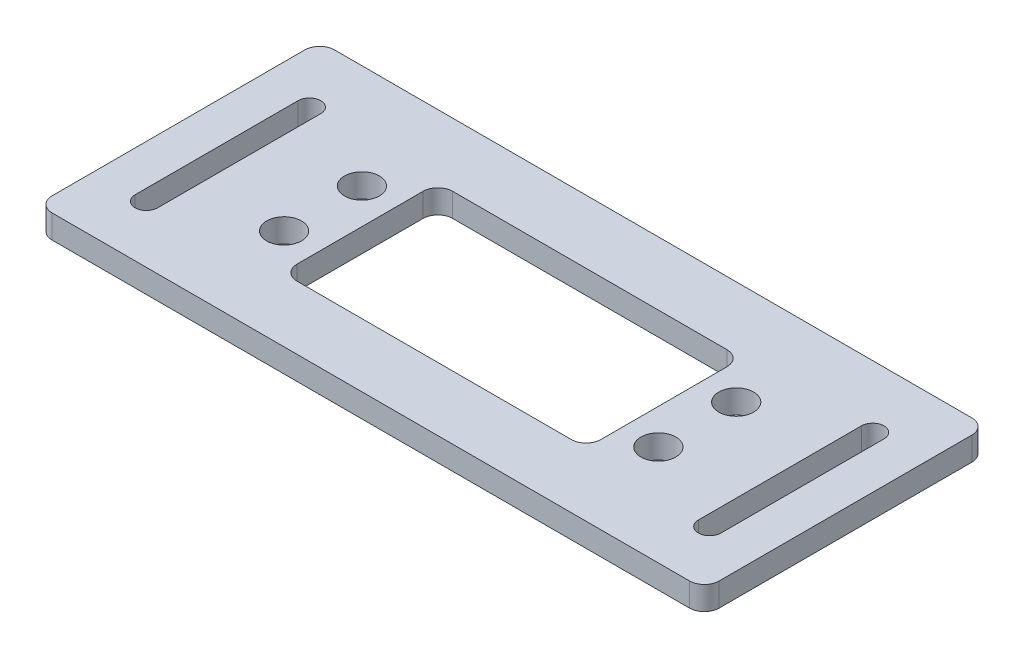
ISO-10303-21;
HEADER;
FILE_DESCRIPTION(('STEP AP214'),'2;1');
FILE_NAME('part.step','',(''),(''),'','','');
FILE_SCHEMA(('AUTOMOTIVE_DESIGN { 1 0 10303 214 1 1 1 1 }'));
ENDSEC;
DATA;
#1=APPLICATION_CONTEXT('core data for automotive mechanical design processes');
#2=APPLICATION_PROTOCOL_DEFINITION('international standard','automotive_design',2000,#1);
#3=PRODUCT_CONTEXT('',#1,'mechanical');
#4=PRODUCT('Part','Part','',(#3));
#5=PRODUCT_RELATED_PRODUCT_CATEGORY('part','',(#4));
#6=PRODUCT_DEFINITION_FORMATION('','',#4);
#7=PRODUCT_DEFINITION_CONTEXT('part definition',#1,'design');
#8=PRODUCT_DEFINITION('design','',#6,#7);
#9=PRODUCT_DEFINITION_SHAPE('','',#8);
#10=(LENGTH_UNIT() NAMED_UNIT(*) SI_UNIT(.MILLI.,.METRE.));
#11=(NAMED_UNIT(*) PLANE_ANGLE_UNIT() SI_UNIT($,.RADIAN.));
#12=(NAMED_UNIT(*) SI_UNIT($,.STERADIAN.) SOLID_ANGLE_UNIT());
#13=UNCERTAINTY_MEASURE_WITH_UNIT(LENGTH_MEASURE(1.E-05),#10,'distance_accuracy_value','');
#14=(GEOMETRIC_REPRESENTATION_CONTEXT(3) GLOBAL_UNCERTAINTY_ASSIGNED_CONTEXT((#13)) GLOBAL_UNIT_ASSIGNED_CONTEXT((#10,
#11,#12)) REPRESENTATION_CONTEXT('',''));
#15=CARTESIAN_POINT('',(0.,0.,0.));
#16=DIRECTION('',(0.,0.,1.));
#17=DIRECTION('',(1.,0.,0.));
#18=AXIS2_PLACEMENT_3D('',#15,#16,#17);
#19=CARTESIAN_POINT('',(-45.,3.175,19.05));
#20=DIRECTION('',(1.,0.,0.));
#21=DIRECTION('',(0.,0.,-1.));
#22=AXIS2_PLACEMENT_3D('',#19,#20,#21);
#23=PLANE('',#22);
#24=DIRECTION('',(0.,0.,1.));
#25=VECTOR('',#24,1.);
#26=CARTESIAN_POINT('',(-45.,3.175,19.05));
#27=LINE('',#26,#25);
#28=CARTESIAN_POINT('',(-45.,3.175,-17.05));
#29=VERTEX_POINT('',#28);
#30=CARTESIAN_POINT('',(-45.,3.175,17.05));
#31=VERTEX_POINT('',#30);
#32=EDGE_CURVE('E310',#29,#31,#27,.T.);
#33=ORIENTED_EDGE('',*,*,#32,.F.);
#34=DIRECTION('',(0.,-1.,0.));
#35=VECTOR('',#34,1.);
#36=CARTESIAN_POINT('',(-45.,3.175,-17.05));
#37=LINE('',#36,#35);
#38=CARTESIAN_POINT('',(-45.,0.,-17.05));
#39=VERTEX_POINT('',#38);
#40=EDGE_CURVE('E335',#29,#39,#37,.T.);
#41=ORIENTED_EDGE('',*,*,#40,.T.);
#42=DIRECTION('',(0.,0.,1.));
#43=VECTOR('',#42,1.);
#44=CARTESIAN_POINT('',(-45.,0.,19.05));
#45=LINE('',#44,#43);
#46=CARTESIAN_POINT('',(-45.,0.,17.05));
#47=VERTEX_POINT('',#46);
#48=EDGE_CURVE('E299',#39,#47,#45,.T.);
#49=ORIENTED_EDGE('',*,*,#48,.T.);
#50=DIRECTION('',(0.,-1.,0.));
#51=VECTOR('',#50,1.);
#52=CARTESIAN_POINT('',(-45.,3.175,17.05));
#53=LINE('',#52,#51);
#54=EDGE_CURVE('E323',#47,#31,#53,.F.);
#55=ORIENTED_EDGE('',*,*,#54,.T.);
#56=EDGE_LOOP('',(#33,#41,#49,#55));
#57=FACE_BOUND('',#56,.T.);
#58=ADVANCED_FACE('F32',(#57),#23,.F.);
#59=CARTESIAN_POINT('',(45.,3.175,19.05));
#60=DIRECTION('',(0.,0.,-1.));
#61=DIRECTION('',(-1.,0.,0.));
#62=AXIS2_PLACEMENT_3D('',#59,#60,#61);
#63=PLANE('',#62);
#64=DIRECTION('',(1.,0.,0.));
#65=VECTOR('',#64,1.);
#66=CARTESIAN_POINT('',(45.,0.,19.05));
#67=LINE('',#66,#65);
#68=CARTESIAN_POINT('',(-43.,0.,19.05));
#69=VERTEX_POINT('',#68);
#70=CARTESIAN_POINT('',(43.,0.,19.05));
#71=VERTEX_POINT('',#70);
#72=EDGE_CURVE('E326',#69,#71,#67,.T.);
#73=ORIENTED_EDGE('',*,*,#72,.T.);
#74=DIRECTION('',(0.,-1.,0.));
#75=VECTOR('',#74,1.);
#76=CARTESIAN_POINT('',(43.,3.175,19.05));
#77=LINE('',#76,#75);
#78=CARTESIAN_POINT('',(43.,3.175,19.05));
#79=VERTEX_POINT('',#78);
#80=EDGE_CURVE('E367',#71,#79,#77,.F.);
#81=ORIENTED_EDGE('',*,*,#80,.T.);
#82=DIRECTION('',(1.,0.,0.));
#83=VECTOR('',#82,1.);
#84=CARTESIAN_POINT('',(45.,3.175,19.05));
#85=LINE('',#84,#83);
#86=CARTESIAN_POINT('',(-43.,3.175,19.05));
#87=VERTEX_POINT('',#86);
#88=EDGE_CURVE('E313',#87,#79,#85,.T.);
#89=ORIENTED_EDGE('',*,*,#88,.F.);
#90=DIRECTION('',(0.,-1.,0.));
#91=VECTOR('',#90,1.);
#92=CARTESIAN_POINT('',(-43.,3.175,19.05));
#93=LINE('',#92,#91);
#94=EDGE_CURVE('E364',#87,#69,#93,.T.);
#95=ORIENTED_EDGE('',*,*,#94,.T.);
#96=EDGE_LOOP('',(#73,#81,#89,#95));
#97=FACE_BOUND('',#96,.T.);
#98=ADVANCED_FACE('F452',(#97),#63,.F.);
#99=CARTESIAN_POINT('',(45.,3.175,19.05));
#100=DIRECTION('',(-1.,0.,0.));
#101=DIRECTION('',(0.,0.,1.));
#102=AXIS2_PLACEMENT_3D('',#99,#100,#101);
#103=PLANE('',#102);
#104=DIRECTION('',(0.,0.,-1.));
#105=VECTOR('',#104,1.);
#106=CARTESIAN_POINT('',(45.,0.,19.05));
#107=LINE('',#106,#105);
#108=CARTESIAN_POINT('',(45.,0.,17.05));
#109=VERTEX_POINT('',#108);
#110=CARTESIAN_POINT('',(45.,0.,-17.05));
#111=VERTEX_POINT('',#110);
#112=EDGE_CURVE('E329',#109,#111,#107,.T.);
#113=ORIENTED_EDGE('',*,*,#112,.T.);
#114=DIRECTION('',(0.,-1.,0.));
#115=VECTOR('',#114,1.);
#116=CARTESIAN_POINT('',(45.,3.175,-17.05));
#117=LINE('',#116,#115);
#118=CARTESIAN_POINT('',(45.,3.175,-17.05));
#119=VERTEX_POINT('',#118);
#120=EDGE_CURVE('E362',#111,#119,#117,.F.);
#121=ORIENTED_EDGE('',*,*,#120,.T.);
#122=DIRECTION('',(0.,0.,-1.));
#123=VECTOR('',#122,1.);
#124=CARTESIAN_POINT('',(45.,3.175,19.05));
#125=LINE('',#124,#123);
#126=CARTESIAN_POINT('',(45.,3.175,17.05));
#127=VERTEX_POINT('',#126);
#128=EDGE_CURVE('E317',#127,#119,#125,.T.);
#129=ORIENTED_EDGE('',*,*,#128,.F.);
#130=DIRECTION('',(0.,-1.,0.));
#131=VECTOR('',#130,1.);
#132=CARTESIAN_POINT('',(45.,3.175,17.05));
#133=LINE('',#132,#131);
#134=EDGE_CURVE('E359',#127,#109,#133,.T.);
#135=ORIENTED_EDGE('',*,*,#134,.T.);
#136=EDGE_LOOP('',(#113,#121,#129,#135));
#137=FACE_BOUND('',#136,.T.);
#138=ADVANCED_FACE('F458',(#137),#103,.F.);
#139=CARTESIAN_POINT('',(45.,3.175,-19.05));
#140=DIRECTION('',(0.,0.,1.));
#141=DIRECTION('',(1.,0.,0.));
#142=AXIS2_PLACEMENT_3D('',#139,#140,#141);
#143=PLANE('',#142);
#144=DIRECTION('',(-1.,0.,0.));
#145=VECTOR('',#144,1.);
#146=CARTESIAN_POINT('',(45.,0.,-19.05));
#147=LINE('',#146,#145);
#148=CARTESIAN_POINT('',(43.,0.,-19.05));
#149=VERTEX_POINT('',#148);
#150=CARTESIAN_POINT('',(-43.,0.,-19.05));
#151=VERTEX_POINT('',#150);
#152=EDGE_CURVE('E314',#149,#151,#147,.T.);
#153=ORIENTED_EDGE('',*,*,#152,.T.);
#154=DIRECTION('',(0.,-1.,0.));
#155=VECTOR('',#154,1.);
#156=CARTESIAN_POINT('',(-43.,3.175,-19.05));
#157=LINE('',#156,#155);
#158=CARTESIAN_POINT('',(-43.,3.175,-19.05));
#159=VERTEX_POINT('',#158);
#160=EDGE_CURVE('E349',#151,#159,#157,.F.);
#161=ORIENTED_EDGE('',*,*,#160,.T.);
#162=DIRECTION('',(-1.,0.,0.));
#163=VECTOR('',#162,1.);
#164=CARTESIAN_POINT('',(45.,3.175,-19.05));
#165=LINE('',#164,#163);
#166=CARTESIAN_POINT('',(43.,3.175,-19.05));
#167=VERTEX_POINT('',#166);
#168=EDGE_CURVE('E320',#167,#159,#165,.T.);
#169=ORIENTED_EDGE('',*,*,#168,.F.);
#170=DIRECTION('',(0.,-1.,0.));
#171=VECTOR('',#170,1.);
#172=CARTESIAN_POINT('',(43.,3.175,-19.05));
#173=LINE('',#172,#171);
#174=EDGE_CURVE('E346',#167,#149,#173,.T.);
#175=ORIENTED_EDGE('',*,*,#174,.T.);
#176=EDGE_LOOP('',(#153,#161,#169,#175));
#177=FACE_BOUND('',#176,.T.);
#178=ADVANCED_FACE('F490',(#177),#143,.F.);
#179=CARTESIAN_POINT('',(0.,3.175,0.));
#180=DIRECTION('',(0.,1.,0.));
#181=DIRECTION('',(0.,0.,1.));
#182=AXIS2_PLACEMENT_3D('',#179,#180,#181);
#183=PLANE('',#182);
#184=CARTESIAN_POINT('',(-38.,3.175,-10.6700415525569));
#185=DIRECTION('',(0.,1.,0.));
#186=DIRECTION('',(0.,0.,1.));
#187=AXIS2_PLACEMENT_3D('',#184,#185,#186);
#188=CIRCLE('',#187,1.525);
#189=CARTESIAN_POINT('',(-36.475,3.175,-10.6700415525569));
#190=VERTEX_POINT('',#189);
#191=CARTESIAN_POINT('',(-39.525,3.175,-10.6700415525569));
#192=VERTEX_POINT('',#191);
#193=EDGE_CURVE('E47',#190,#192,#188,.T.);
#194=ORIENTED_EDGE('',*,*,#193,.F.);
#195=DIRECTION('',(0.,0.,-1.));
#196=VECTOR('',#195,1.);
#197=CARTESIAN_POINT('',(-36.475,3.175,-10.6700415525569));
#198=LINE('',#197,#196);
#199=CARTESIAN_POINT('',(-36.475,3.175,11.3299584474431));
#200=VERTEX_POINT('',#199);
#201=EDGE_CURVE('E213',#200,#190,#198,.T.);
#202=ORIENTED_EDGE('',*,*,#201,.F.);
#203=CARTESIAN_POINT('',(-38.,3.175,11.3299584474431));
#204=DIRECTION('',(0.,1.,0.));
#205=DIRECTION('',(0.,0.,1.));
#206=AXIS2_PLACEMENT_3D('',#203,#204,#205);
#207=CIRCLE('',#206,1.525);
#208=CARTESIAN_POINT('',(-39.525,3.175,11.3299584474431));
#209=VERTEX_POINT('',#208);
#210=EDGE_CURVE('E216',#209,#200,#207,.T.);
#211=ORIENTED_EDGE('',*,*,#210,.F.);
#212=DIRECTION('',(0.,0.,1.));
#213=VECTOR('',#212,1.);
#214=CARTESIAN_POINT('',(-39.525,3.175,-10.6700415525569));
#215=LINE('',#214,#213);
#216=EDGE_CURVE('E222',#192,#209,#215,.T.);
#217=ORIENTED_EDGE('',*,*,#216,.F.);
#218=EDGE_LOOP('',(#194,#202,#211,#217));
#219=FACE_BOUND('',#218,.T.);
#220=CARTESIAN_POINT('',(38.,3.175,-10.6700415525569));
#221=DIRECTION('',(0.,1.,0.));
#222=DIRECTION('',(0.,0.,-1.));
#223=AXIS2_PLACEMENT_3D('',#220,#221,#222);
#224=CIRCLE('',#223,1.525);
#225=CARTESIAN_POINT('',(39.525,3.175,-10.6700415525569));
#226=VERTEX_POINT('',#225);
#227=CARTESIAN_POINT('',(36.475,3.175,-10.6700415525569));
#228=VERTEX_POINT('',#227);
#229=EDGE_CURVE('E55',#226,#228,#224,.T.);
#230=ORIENTED_EDGE('',*,*,#229,.F.);
#231=DIRECTION('',(0.,0.,-1.));
#232=VECTOR('',#231,1.);
#233=CARTESIAN_POINT('',(39.525,3.175,-10.6700415525569));
#234=LINE('',#233,#232);
#235=CARTESIAN_POINT('',(39.525,3.175,11.3299584474431));
#236=VERTEX_POINT('',#235);
#237=EDGE_CURVE('E237',#236,#226,#234,.T.);
#238=ORIENTED_EDGE('',*,*,#237,.F.);
#239=CARTESIAN_POINT('',(38.,3.175,11.3299584474431));
#240=DIRECTION('',(0.,1.,0.));
#241=DIRECTION('',(0.,0.,-1.));
#242=AXIS2_PLACEMENT_3D('',#239,#240,#241);
#243=CIRCLE('',#242,1.525);
#244=CARTESIAN_POINT('',(36.475,3.175,11.3299584474431));
#245=VERTEX_POINT('',#244);
#246=EDGE_CURVE('E251',#245,#236,#243,.T.);
#247=ORIENTED_EDGE('',*,*,#246,.F.);
#248=DIRECTION('',(0.,0.,1.));
#249=VECTOR('',#248,1.);
#250=CARTESIAN_POINT('',(36.475,3.175,-10.6700415525569));
#251=LINE('',#250,#249);
#252=EDGE_CURVE('E248',#228,#245,#251,.T.);
#253=ORIENTED_EDGE('',*,*,#252,.F.);
#254=EDGE_LOOP('',(#230,#238,#247,#253));
#255=FACE_BOUND('',#254,.T.);
#256=CARTESIAN_POINT('',(25.25,3.175,5.50332943757828));
#257=DIRECTION('',(0.,1.,0.));
#258=DIRECTION('',(0.,0.,-1.));
#259=AXIS2_PLACEMENT_3D('',#256,#257,#258);
#260=CIRCLE('',#259,2.35);
#261=CARTESIAN_POINT('',(25.25,3.175,3.15332943757828));
#262=VERTEX_POINT('',#261);
#263=EDGE_CURVE('E229',#262,#262,#260,.T.);
#264=ORIENTED_EDGE('',*,*,#263,.F.);
#265=EDGE_LOOP('',(#264));
#266=FACE_BOUND('',#265,.T.);
#267=CARTESIAN_POINT('',(25.25,3.175,-4.99999999999997));
#268=DIRECTION('',(0.,1.,0.));
#269=DIRECTION('',(0.,0.,-1.));
#270=AXIS2_PLACEMENT_3D('',#267,#268,#269);
#271=CIRCLE('',#270,2.35);
#272=CARTESIAN_POINT('',(25.25,3.175,-7.34999999999997));
#273=VERTEX_POINT('',#272);
#274=EDGE_CURVE('E278',#273,#273,#271,.T.);
#275=ORIENTED_EDGE('',*,*,#274,.F.);
#276=EDGE_LOOP('',(#275));
#277=FACE_BOUND('',#276,.T.);
#278=CARTESIAN_POINT('',(-25.25,3.175,5.50332943757826));
#279=DIRECTION('',(0.,1.,0.));
#280=DIRECTION('',(0.,0.,1.));
#281=AXIS2_PLACEMENT_3D('',#278,#279,#280);
#282=CIRCLE('',#281,2.35);
#283=CARTESIAN_POINT('',(-25.25,3.175,7.85332943757826));
#284=VERTEX_POINT('',#283);
#285=EDGE_CURVE('E272',#284,#284,#282,.T.);
#286=ORIENTED_EDGE('',*,*,#285,.F.);
#287=EDGE_LOOP('',(#286));
#288=FACE_BOUND('',#287,.T.);
#289=CARTESIAN_POINT('',(-25.25,3.175,-5.));
#290=DIRECTION('',(0.,1.,0.));
#291=DIRECTION('',(0.,0.,1.));
#292=AXIS2_PLACEMENT_3D('',#289,#290,#291);
#293=CIRCLE('',#292,2.35);
#294=CARTESIAN_POINT('',(-25.25,3.175,-2.65));
#295=VERTEX_POINT('',#294);
#296=EDGE_CURVE('E266',#295,#295,#293,.T.);
#297=ORIENTED_EDGE('',*,*,#296,.F.);
#298=EDGE_LOOP('',(#297));
#299=FACE_BOUND('',#298,.T.);
#300=DIRECTION('',(0.,0.,1.));
#301=VECTOR('',#300,1.);
#302=CARTESIAN_POINT('',(-20.5,3.175,10.5));
#303=LINE('',#302,#301);
#304=CARTESIAN_POINT('',(-20.5,3.175,-8.49999999999999));
#305=VERTEX_POINT('',#304);
#306=CARTESIAN_POINT('',(-20.5,3.175,8.5));
#307=VERTEX_POINT('',#306);
#308=EDGE_CURVE('E265',#305,#307,#303,.T.);
#309=ORIENTED_EDGE('',*,*,#308,.F.);
#310=CARTESIAN_POINT('',(-18.5,3.175,-8.5));
#311=DIRECTION('',(0.,1.,0.));
#312=DIRECTION('',(0.,0.,1.));
#313=AXIS2_PLACEMENT_3D('',#310,#311,#312);
#314=CIRCLE('',#313,2.);
#315=CARTESIAN_POINT('',(-18.5,3.175,-10.5));
#316=VERTEX_POINT('',#315);
#317=EDGE_CURVE('E40',#305,#316,#314,.F.);
#318=ORIENTED_EDGE('',*,*,#317,.T.);
#319=DIRECTION('',(-1.,0.,0.));
#320=VECTOR('',#319,1.);
#321=CARTESIAN_POINT('',(20.5,3.175,-10.5));
#322=LINE('',#321,#320);
#323=CARTESIAN_POINT('',(18.5,3.175,-10.5));
#324=VERTEX_POINT('',#323);
#325=EDGE_CURVE('E290',#324,#316,#322,.T.);
#326=ORIENTED_EDGE('',*,*,#325,.F.);
#327=CARTESIAN_POINT('',(18.5,3.175,-8.50000000000001));
#328=DIRECTION('',(0.,1.,0.));
#329=DIRECTION('',(0.,0.,1.));
#330=AXIS2_PLACEMENT_3D('',#327,#328,#329);
#331=CIRCLE('',#330,2.);
#332=CARTESIAN_POINT('',(20.5,3.175,-8.5));
#333=VERTEX_POINT('',#332);
#334=EDGE_CURVE('E389',#324,#333,#331,.F.);
#335=ORIENTED_EDGE('',*,*,#334,.T.);
#336=DIRECTION('',(0.,0.,-1.));
#337=VECTOR('',#336,1.);
#338=CARTESIAN_POINT('',(20.5,3.175,10.5));
#339=LINE('',#338,#337);
#340=CARTESIAN_POINT('',(20.5,3.175,8.5));
#341=VERTEX_POINT('',#340);
#342=EDGE_CURVE('E305',#341,#333,#339,.T.);
#343=ORIENTED_EDGE('',*,*,#342,.F.);
#344=CARTESIAN_POINT('',(18.5,3.175,8.49999999999999));
#345=DIRECTION('',(0.,1.,0.));
#346=DIRECTION('',(0.,0.,1.));
#347=AXIS2_PLACEMENT_3D('',#344,#345,#346);
#348=CIRCLE('',#347,2.);
#349=CARTESIAN_POINT('',(18.5,3.175,10.5));
#350=VERTEX_POINT('',#349);
#351=EDGE_CURVE('E393',#341,#350,#348,.F.);
#352=ORIENTED_EDGE('',*,*,#351,.T.);
#353=DIRECTION('',(1.,0.,0.));
#354=VECTOR('',#353,1.);
#355=CARTESIAN_POINT('',(20.5,3.175,10.5));
#356=LINE('',#355,#354);
#357=CARTESIAN_POINT('',(-18.5,3.175,10.5));
#358=VERTEX_POINT('',#357);
#359=EDGE_CURVE('E302',#358,#350,#356,.T.);
#360=ORIENTED_EDGE('',*,*,#359,.F.);
#361=CARTESIAN_POINT('',(-18.5,3.175,8.5));
#362=DIRECTION('',(0.,1.,0.));
#363=DIRECTION('',(0.,0.,1.));
#364=AXIS2_PLACEMENT_3D('',#361,#362,#363);
#365=CIRCLE('',#364,2.);
#366=EDGE_CURVE('E397',#358,#307,#365,.F.);
#367=ORIENTED_EDGE('',*,*,#366,.T.);
#368=EDGE_LOOP('',(#309,#318,#326,#335,#343,#352,#360,#367));
#369=FACE_BOUND('',#368,.T.);
#370=ORIENTED_EDGE('',*,*,#168,.T.);
#371=CARTESIAN_POINT('',(-43.,3.175,-17.05));
#372=DIRECTION('',(0.,1.,0.));
#373=DIRECTION('',(0.,0.,1.));
#374=AXIS2_PLACEMENT_3D('',#371,#372,#373);
#375=CIRCLE('',#374,2.);
#376=EDGE_CURVE('E357',#159,#29,#375,.T.);
#377=ORIENTED_EDGE('',*,*,#376,.T.);
#378=ORIENTED_EDGE('',*,*,#32,.T.);
#379=CARTESIAN_POINT('',(-43.,3.175,17.05));
#380=DIRECTION('',(0.,1.,0.));
#381=DIRECTION('',(0.,0.,1.));
#382=AXIS2_PLACEMENT_3D('',#379,#380,#381);
#383=CIRCLE('',#382,2.);
#384=EDGE_CURVE('E351',#31,#87,#383,.T.);
#385=ORIENTED_EDGE('',*,*,#384,.T.);
#386=ORIENTED_EDGE('',*,*,#88,.T.);
#387=CARTESIAN_POINT('',(43.,3.175,17.05));
#388=DIRECTION('',(0.,1.,0.));
#389=DIRECTION('',(0.,0.,1.));
#390=AXIS2_PLACEMENT_3D('',#387,#388,#389);
#391=CIRCLE('',#390,2.);
#392=EDGE_CURVE('E353',#79,#127,#391,.T.);
#393=ORIENTED_EDGE('',*,*,#392,.T.);
#394=ORIENTED_EDGE('',*,*,#128,.T.);
#395=CARTESIAN_POINT('',(43.,3.175,-17.05));
#396=DIRECTION('',(0.,1.,0.));
#397=DIRECTION('',(0.,0.,1.));
#398=AXIS2_PLACEMENT_3D('',#395,#396,#397);
#399=CIRCLE('',#398,2.);
#400=EDGE_CURVE('E355',#119,#167,#399,.T.);
#401=ORIENTED_EDGE('',*,*,#400,.T.);
#402=EDGE_LOOP('',(#370,#377,#378,#385,#386,#393,#394,#401));
#403=FACE_BOUND('',#402,.T.);
#404=ADVANCED_FACE('F403',(#219,#255,#266,#277,#288,#299,#369,#403),#183,.T.);
#405=CARTESIAN_POINT('',(0.,0.,0.));
#406=DIRECTION('',(0.,1.,0.));
#407=DIRECTION('',(0.,0.,1.));
#408=AXIS2_PLACEMENT_3D('',#405,#406,#407);
#409=PLANE('',#408);
#410=DIRECTION('',(0.,0.,-1.));
#411=VECTOR('',#410,1.);
#412=CARTESIAN_POINT('',(-36.475,0.,-10.6700415525569));
#413=LINE('',#412,#411);
#414=CARTESIAN_POINT('',(-36.475,0.,11.3299584474431));
#415=VERTEX_POINT('',#414);
#416=CARTESIAN_POINT('',(-36.475,0.,-10.6700415525569));
#417=VERTEX_POINT('',#416);
#418=EDGE_CURVE('E200',#415,#417,#413,.T.);
#419=ORIENTED_EDGE('',*,*,#418,.T.);
#420=CARTESIAN_POINT('',(-38.,0.,-10.6700415525569));
#421=DIRECTION('',(0.,1.,0.));
#422=DIRECTION('',(0.,0.,1.));
#423=AXIS2_PLACEMENT_3D('',#420,#421,#422);
#424=CIRCLE('',#423,1.525);
#425=CARTESIAN_POINT('',(-39.525,0.,-10.6700415525569));
#426=VERTEX_POINT('',#425);
#427=EDGE_CURVE('E194',#417,#426,#424,.T.);
#428=ORIENTED_EDGE('',*,*,#427,.T.);
#429=DIRECTION('',(0.,0.,1.));
#430=VECTOR('',#429,1.);
#431=CARTESIAN_POINT('',(-39.525,0.,-10.6700415525569));
#432=LINE('',#431,#430);
#433=CARTESIAN_POINT('',(-39.525,0.,11.3299584474431));
#434=VERTEX_POINT('',#433);
#435=EDGE_CURVE('E204',#426,#434,#432,.T.);
#436=ORIENTED_EDGE('',*,*,#435,.T.);
#437=CARTESIAN_POINT('',(-38.,0.,11.3299584474431));
#438=DIRECTION('',(0.,1.,0.));
#439=DIRECTION('',(0.,0.,1.));
#440=AXIS2_PLACEMENT_3D('',#437,#438,#439);
#441=CIRCLE('',#440,1.525);
#442=EDGE_CURVE('E208',#434,#415,#441,.T.);
#443=ORIENTED_EDGE('',*,*,#442,.T.);
#444=EDGE_LOOP('',(#419,#428,#436,#443));
#445=FACE_BOUND('',#444,.T.);
#446=DIRECTION('',(0.,0.,-1.));
#447=VECTOR('',#446,1.);
#448=CARTESIAN_POINT('',(39.525,0.,-10.6700415525569));
#449=LINE('',#448,#447);
#450=CARTESIAN_POINT('',(39.525,0.,11.3299584474431));
#451=VERTEX_POINT('',#450);
#452=CARTESIAN_POINT('',(39.525,0.,-10.6700415525569));
#453=VERTEX_POINT('',#452);
#454=EDGE_CURVE('E243',#451,#453,#449,.T.);
#455=ORIENTED_EDGE('',*,*,#454,.T.);
#456=CARTESIAN_POINT('',(38.,0.,-10.6700415525569));
#457=DIRECTION('',(0.,1.,0.));
#458=DIRECTION('',(0.,0.,-1.));
#459=AXIS2_PLACEMENT_3D('',#456,#457,#458);
#460=CIRCLE('',#459,1.525);
#461=CARTESIAN_POINT('',(36.475,0.,-10.6700415525569));
#462=VERTEX_POINT('',#461);
#463=EDGE_CURVE('E233',#453,#462,#460,.T.);
#464=ORIENTED_EDGE('',*,*,#463,.T.);
#465=DIRECTION('',(0.,0.,1.));
#466=VECTOR('',#465,1.);
#467=CARTESIAN_POINT('',(36.475,0.,-10.6700415525569));
#468=LINE('',#467,#466);
#469=CARTESIAN_POINT('',(36.475,0.,11.3299584474431));
#470=VERTEX_POINT('',#469);
#471=EDGE_CURVE('E236',#462,#470,#468,.T.);
#472=ORIENTED_EDGE('',*,*,#471,.T.);
#473=CARTESIAN_POINT('',(38.,0.,11.3299584474431));
#474=DIRECTION('',(0.,1.,0.));
#475=DIRECTION('',(0.,0.,-1.));
#476=AXIS2_PLACEMENT_3D('',#473,#474,#475);
#477=CIRCLE('',#476,1.525);
#478=EDGE_CURVE('E240',#470,#451,#477,.T.);
#479=ORIENTED_EDGE('',*,*,#478,.T.);
#480=EDGE_LOOP('',(#455,#464,#472,#479));
#481=FACE_BOUND('',#480,.T.);
#482=CARTESIAN_POINT('',(25.25,0.,5.50332943757828));
#483=DIRECTION('',(0.,1.,0.));
#484=DIRECTION('',(0.,0.,-1.));
#485=AXIS2_PLACEMENT_3D('',#482,#483,#484);
#486=CIRCLE('',#485,2.35);
#487=CARTESIAN_POINT('',(25.25,0.,3.15332943757828));
#488=VERTEX_POINT('',#487);
#489=EDGE_CURVE('E281',#488,#488,#486,.T.);
#490=ORIENTED_EDGE('',*,*,#489,.T.);
#491=EDGE_LOOP('',(#490));
#492=FACE_BOUND('',#491,.T.);
#493=CARTESIAN_POINT('',(25.25,0.,-4.99999999999997));
#494=DIRECTION('',(0.,1.,0.));
#495=DIRECTION('',(0.,0.,-1.));
#496=AXIS2_PLACEMENT_3D('',#493,#494,#495);
#497=CIRCLE('',#496,2.35);
#498=CARTESIAN_POINT('',(25.25,0.,-7.34999999999997));
#499=VERTEX_POINT('',#498);
#500=EDGE_CURVE('E275',#499,#499,#497,.T.);
#501=ORIENTED_EDGE('',*,*,#500,.T.);
#502=EDGE_LOOP('',(#501));
#503=FACE_BOUND('',#502,.T.);
#504=CARTESIAN_POINT('',(-25.25,0.,5.50332943757826));
#505=DIRECTION('',(0.,1.,0.));
#506=DIRECTION('',(0.,0.,1.));
#507=AXIS2_PLACEMENT_3D('',#504,#505,#506);
#508=CIRCLE('',#507,2.35);
#509=CARTESIAN_POINT('',(-25.25,0.,7.85332943757826));
#510=VERTEX_POINT('',#509);
#511=EDGE_CURVE('E269',#510,#510,#508,.T.);
#512=ORIENTED_EDGE('',*,*,#511,.T.);
#513=EDGE_LOOP('',(#512));
#514=FACE_BOUND('',#513,.T.);
#515=CARTESIAN_POINT('',(-25.25,0.,-5.));
#516=DIRECTION('',(0.,1.,0.));
#517=DIRECTION('',(0.,0.,1.));
#518=AXIS2_PLACEMENT_3D('',#515,#516,#517);
#519=CIRCLE('',#518,2.35);
#520=CARTESIAN_POINT('',(-25.25,0.,-2.65));
#521=VERTEX_POINT('',#520);
#522=EDGE_CURVE('E262',#521,#521,#519,.T.);
#523=ORIENTED_EDGE('',*,*,#522,.T.);
#524=EDGE_LOOP('',(#523));
#525=FACE_BOUND('',#524,.T.);
#526=DIRECTION('',(0.,0.,-1.));
#527=VECTOR('',#526,1.);
#528=CARTESIAN_POINT('',(20.5,0.,10.5));
#529=LINE('',#528,#527);
#530=CARTESIAN_POINT('',(20.5,0.,8.5));
#531=VERTEX_POINT('',#530);
#532=CARTESIAN_POINT('',(20.5,0.,-8.5));
#533=VERTEX_POINT('',#532);
#534=EDGE_CURVE('E293',#531,#533,#529,.T.);
#535=ORIENTED_EDGE('',*,*,#534,.T.);
#536=CARTESIAN_POINT('',(18.5,0.,-8.50000000000001));
#537=DIRECTION('',(0.,1.,0.));
#538=DIRECTION('',(0.,0.,1.));
#539=AXIS2_PLACEMENT_3D('',#536,#537,#538);
#540=CIRCLE('',#539,2.);
#541=CARTESIAN_POINT('',(18.5,0.,-10.5));
#542=VERTEX_POINT('',#541);
#543=EDGE_CURVE('E391',#533,#542,#540,.T.);
#544=ORIENTED_EDGE('',*,*,#543,.T.);
#545=DIRECTION('',(-1.,0.,0.));
#546=VECTOR('',#545,1.);
#547=CARTESIAN_POINT('',(20.5,0.,-10.5));
#548=LINE('',#547,#546);
#549=CARTESIAN_POINT('',(-18.5,0.,-10.5));
#550=VERTEX_POINT('',#549);
#551=EDGE_CURVE('E296',#542,#550,#548,.T.);
#552=ORIENTED_EDGE('',*,*,#551,.T.);
#553=CARTESIAN_POINT('',(-18.5,0.,-8.5));
#554=DIRECTION('',(0.,1.,0.));
#555=DIRECTION('',(0.,0.,1.));
#556=AXIS2_PLACEMENT_3D('',#553,#554,#555);
#557=CIRCLE('',#556,2.);
#558=CARTESIAN_POINT('',(-20.5,0.,-8.49999999999999));
#559=VERTEX_POINT('',#558);
#560=EDGE_CURVE('E11',#550,#559,#557,.T.);
#561=ORIENTED_EDGE('',*,*,#560,.T.);
#562=DIRECTION('',(0.,0.,1.));
#563=VECTOR('',#562,1.);
#564=CARTESIAN_POINT('',(-20.5,0.,10.5));
#565=LINE('',#564,#563);
#566=CARTESIAN_POINT('',(-20.5,0.,8.5));
#567=VERTEX_POINT('',#566);
#568=EDGE_CURVE('E286',#559,#567,#565,.T.);
#569=ORIENTED_EDGE('',*,*,#568,.T.);
#570=CARTESIAN_POINT('',(-18.5,0.,8.5));
#571=DIRECTION('',(0.,1.,0.));
#572=DIRECTION('',(0.,0.,1.));
#573=AXIS2_PLACEMENT_3D('',#570,#571,#572);
#574=CIRCLE('',#573,2.);
#575=CARTESIAN_POINT('',(-18.5,0.,10.5));
#576=VERTEX_POINT('',#575);
#577=EDGE_CURVE('E399',#567,#576,#574,.T.);
#578=ORIENTED_EDGE('',*,*,#577,.T.);
#579=DIRECTION('',(1.,0.,0.));
#580=VECTOR('',#579,1.);
#581=CARTESIAN_POINT('',(20.5,0.,10.5));
#582=LINE('',#581,#580);
#583=CARTESIAN_POINT('',(18.5,0.,10.5));
#584=VERTEX_POINT('',#583);
#585=EDGE_CURVE('E289',#576,#584,#582,.T.);
#586=ORIENTED_EDGE('',*,*,#585,.T.);
#587=CARTESIAN_POINT('',(18.5,0.,8.49999999999999));
#588=DIRECTION('',(0.,1.,0.));
#589=DIRECTION('',(0.,0.,1.));
#590=AXIS2_PLACEMENT_3D('',#587,#588,#589);
#591=CIRCLE('',#590,2.);
#592=EDGE_CURVE('E395',#584,#531,#591,.T.);
#593=ORIENTED_EDGE('',*,*,#592,.T.);
#594=EDGE_LOOP('',(#535,#544,#552,#561,#569,#578,#586,#593));
#595=FACE_BOUND('',#594,.T.);
#596=ORIENTED_EDGE('',*,*,#48,.F.);
#597=CARTESIAN_POINT('',(-43.,0.,-17.05));
#598=DIRECTION('',(0.,1.,0.));
#599=DIRECTION('',(0.,0.,1.));
#600=AXIS2_PLACEMENT_3D('',#597,#598,#599);
#601=CIRCLE('',#600,2.);
#602=EDGE_CURVE('E344',#39,#151,#601,.F.);
#603=ORIENTED_EDGE('',*,*,#602,.T.);
#604=ORIENTED_EDGE('',*,*,#152,.F.);
#605=CARTESIAN_POINT('',(43.,0.,-17.05));
#606=DIRECTION('',(0.,1.,0.));
#607=DIRECTION('',(0.,0.,1.));
#608=AXIS2_PLACEMENT_3D('',#605,#606,#607);
#609=CIRCLE('',#608,2.);
#610=EDGE_CURVE('E342',#149,#111,#609,.F.);
#611=ORIENTED_EDGE('',*,*,#610,.T.);
#612=ORIENTED_EDGE('',*,*,#112,.F.);
#613=CARTESIAN_POINT('',(43.,0.,17.05));
#614=DIRECTION('',(0.,1.,0.));
#615=DIRECTION('',(0.,0.,1.));
#616=AXIS2_PLACEMENT_3D('',#613,#614,#615);
#617=CIRCLE('',#616,2.);
#618=EDGE_CURVE('E340',#109,#71,#617,.F.);
#619=ORIENTED_EDGE('',*,*,#618,.T.);
#620=ORIENTED_EDGE('',*,*,#72,.F.);
#621=CARTESIAN_POINT('',(-43.,0.,17.05));
#622=DIRECTION('',(0.,1.,0.));
#623=DIRECTION('',(0.,0.,1.));
#624=AXIS2_PLACEMENT_3D('',#621,#622,#623);
#625=CIRCLE('',#624,2.);
#626=EDGE_CURVE('E338',#69,#47,#625,.F.);
#627=ORIENTED_EDGE('',*,*,#626,.T.);
#628=EDGE_LOOP('',(#596,#603,#604,#611,#612,#619,#620,#627));
#629=FACE_BOUND('',#628,.T.);
#630=ADVANCED_FACE('F210',(#445,#481,#492,#503,#514,#525,#595,#629),#409,.F.);
#631=CARTESIAN_POINT('',(-20.5,0.,10.5));
#632=DIRECTION('',(-1.,0.,0.));
#633=DIRECTION('',(0.,0.,1.));
#634=AXIS2_PLACEMENT_3D('',#631,#632,#633);
#635=PLANE('',#634);
#636=ORIENTED_EDGE('',*,*,#308,.T.);
#637=DIRECTION('',(0.,1.,0.));
#638=VECTOR('',#637,1.);
#639=CARTESIAN_POINT('',(-20.5,0.,8.5));
#640=LINE('',#639,#638);
#641=EDGE_CURVE('E387',#307,#567,#640,.F.);
#642=ORIENTED_EDGE('',*,*,#641,.T.);
#643=ORIENTED_EDGE('',*,*,#568,.F.);
#644=DIRECTION('',(0.,1.,0.));
#645=VECTOR('',#644,1.);
#646=CARTESIAN_POINT('',(-20.5,3.175,-8.5));
#647=LINE('',#646,#645);
#648=EDGE_CURVE('E384',#559,#305,#647,.T.);
#649=ORIENTED_EDGE('',*,*,#648,.T.);
#650=EDGE_LOOP('',(#636,#642,#643,#649));
#651=FACE_BOUND('',#650,.T.);
#652=ADVANCED_FACE('F418',(#651),#635,.F.);
#653=CARTESIAN_POINT('',(20.5,0.,-10.5));
#654=DIRECTION('',(0.,0.,-1.));
#655=DIRECTION('',(-1.,0.,0.));
#656=AXIS2_PLACEMENT_3D('',#653,#654,#655);
#657=PLANE('',#656);
#658=ORIENTED_EDGE('',*,*,#551,.F.);
#659=DIRECTION('',(0.,1.,0.));
#660=VECTOR('',#659,1.);
#661=CARTESIAN_POINT('',(18.5,3.175,-10.5));
#662=LINE('',#661,#660);
#663=EDGE_CURVE('E371',#542,#324,#662,.T.);
#664=ORIENTED_EDGE('',*,*,#663,.T.);
#665=ORIENTED_EDGE('',*,*,#325,.T.);
#666=DIRECTION('',(0.,1.,0.));
#667=VECTOR('',#666,1.);
#668=CARTESIAN_POINT('',(-18.5,0.,-10.5));
#669=LINE('',#668,#667);
#670=EDGE_CURVE('E369',#316,#550,#669,.F.);
#671=ORIENTED_EDGE('',*,*,#670,.T.);
#672=EDGE_LOOP('',(#658,#664,#665,#671));
#673=FACE_BOUND('',#672,.T.);
#674=ADVANCED_FACE('F410',(#673),#657,.F.);
#675=CARTESIAN_POINT('',(20.5,0.,10.5));
#676=DIRECTION('',(1.,0.,0.));
#677=DIRECTION('',(0.,0.,-1.));
#678=AXIS2_PLACEMENT_3D('',#675,#676,#677);
#679=PLANE('',#678);
#680=ORIENTED_EDGE('',*,*,#342,.T.);
#681=DIRECTION('',(0.,1.,0.));
#682=VECTOR('',#681,1.);
#683=CARTESIAN_POINT('',(20.5,0.,-8.50000000000001));
#684=LINE('',#683,#682);
#685=EDGE_CURVE('E377',#333,#533,#684,.F.);
#686=ORIENTED_EDGE('',*,*,#685,.T.);
#687=ORIENTED_EDGE('',*,*,#534,.F.);
#688=DIRECTION('',(0.,1.,0.));
#689=VECTOR('',#688,1.);
#690=CARTESIAN_POINT('',(20.5,3.175,8.49999999999999));
#691=LINE('',#690,#689);
#692=EDGE_CURVE('E374',#531,#341,#691,.T.);
#693=ORIENTED_EDGE('',*,*,#692,.T.);
#694=EDGE_LOOP('',(#680,#686,#687,#693));
#695=FACE_BOUND('',#694,.T.);
#696=ADVANCED_FACE('F435',(#695),#679,.F.);
#697=CARTESIAN_POINT('',(20.5,0.,10.5));
#698=DIRECTION('',(0.,0.,1.));
#699=DIRECTION('',(1.,0.,0.));
#700=AXIS2_PLACEMENT_3D('',#697,#698,#699);
#701=PLANE('',#700);
#702=ORIENTED_EDGE('',*,*,#359,.T.);
#703=DIRECTION('',(0.,1.,0.));
#704=VECTOR('',#703,1.);
#705=CARTESIAN_POINT('',(18.5,0.,10.5));
#706=LINE('',#705,#704);
#707=EDGE_CURVE('E382',#350,#584,#706,.F.);
#708=ORIENTED_EDGE('',*,*,#707,.T.);
#709=ORIENTED_EDGE('',*,*,#585,.F.);
#710=DIRECTION('',(0.,1.,0.));
#711=VECTOR('',#710,1.);
#712=CARTESIAN_POINT('',(-18.5,3.175,10.5));
#713=LINE('',#712,#711);
#714=EDGE_CURVE('E379',#576,#358,#713,.T.);
#715=ORIENTED_EDGE('',*,*,#714,.T.);
#716=EDGE_LOOP('',(#702,#708,#709,#715));
#717=FACE_BOUND('',#716,.T.);
#718=ADVANCED_FACE('F426',(#717),#701,.F.);
#719=CARTESIAN_POINT('',(-25.25,0.,-5.));
#720=DIRECTION('',(0.,1.,0.));
#721=DIRECTION('',(0.,0.,1.));
#722=AXIS2_PLACEMENT_3D('',#719,#720,#721);
#723=CYLINDRICAL_SURFACE('',#722,2.35);
#724=ORIENTED_EDGE('',*,*,#522,.F.);
#725=EDGE_LOOP('',(#724));
#726=FACE_BOUND('',#725,.T.);
#727=ORIENTED_EDGE('',*,*,#296,.T.);
#728=EDGE_LOOP('',(#727));
#729=FACE_BOUND('',#728,.T.);
#730=ADVANCED_FACE('F614',(#726,#729),#723,.F.);
#731=CARTESIAN_POINT('',(-25.25,0.,5.50332943757826));
#732=DIRECTION('',(0.,1.,0.));
#733=DIRECTION('',(0.,0.,1.));
#734=AXIS2_PLACEMENT_3D('',#731,#732,#733);
#735=CYLINDRICAL_SURFACE('',#734,2.35);
#736=ORIENTED_EDGE('',*,*,#511,.F.);
#737=EDGE_LOOP('',(#736));
#738=FACE_BOUND('',#737,.T.);
#739=ORIENTED_EDGE('',*,*,#285,.T.);
#740=EDGE_LOOP('',(#739));
#741=FACE_BOUND('',#740,.T.);
#742=ADVANCED_FACE('F617',(#738,#741),#735,.F.);
#743=CARTESIAN_POINT('',(25.25,0.,-4.99999999999997));
#744=DIRECTION('',(0.,1.,0.));
#745=DIRECTION('',(0.,0.,1.));
#746=AXIS2_PLACEMENT_3D('',#743,#744,#745);
#747=CYLINDRICAL_SURFACE('',#746,2.35);
#748=ORIENTED_EDGE('',*,*,#500,.F.);
#749=EDGE_LOOP('',(#748));
#750=FACE_BOUND('',#749,.T.);
#751=ORIENTED_EDGE('',*,*,#274,.T.);
#752=EDGE_LOOP('',(#751));
#753=FACE_BOUND('',#752,.T.);
#754=ADVANCED_FACE('F621',(#750,#753),#747,.F.);
#755=CARTESIAN_POINT('',(25.25,0.,5.50332943757828));
#756=DIRECTION('',(0.,1.,0.));
#757=DIRECTION('',(0.,0.,1.));
#758=AXIS2_PLACEMENT_3D('',#755,#756,#757);
#759=CYLINDRICAL_SURFACE('',#758,2.35);
#760=ORIENTED_EDGE('',*,*,#489,.F.);
#761=EDGE_LOOP('',(#760));
#762=FACE_BOUND('',#761,.T.);
#763=ORIENTED_EDGE('',*,*,#263,.T.);
#764=EDGE_LOOP('',(#763));
#765=FACE_BOUND('',#764,.T.);
#766=ADVANCED_FACE('F468',(#762,#765),#759,.F.);
#767=CARTESIAN_POINT('',(-43.,3.175,-17.05));
#768=DIRECTION('',(0.,-1.,0.));
#769=DIRECTION('',(0.,0.,-1.));
#770=AXIS2_PLACEMENT_3D('',#767,#768,#769);
#771=CYLINDRICAL_SURFACE('',#770,2.);
#772=ORIENTED_EDGE('',*,*,#376,.F.);
#773=ORIENTED_EDGE('',*,*,#160,.F.);
#774=ORIENTED_EDGE('',*,*,#602,.F.);
#775=ORIENTED_EDGE('',*,*,#40,.F.);
#776=EDGE_LOOP('',(#772,#773,#774,#775));
#777=FACE_BOUND('',#776,.T.);
#778=ADVANCED_FACE('F464',(#777),#771,.T.);
#779=CARTESIAN_POINT('',(43.,3.175,-17.05));
#780=DIRECTION('',(0.,-1.,0.));
#781=DIRECTION('',(0.,0.,-1.));
#782=AXIS2_PLACEMENT_3D('',#779,#780,#781);
#783=CYLINDRICAL_SURFACE('',#782,2.);
#784=ORIENTED_EDGE('',*,*,#400,.F.);
#785=ORIENTED_EDGE('',*,*,#120,.F.);
#786=ORIENTED_EDGE('',*,*,#610,.F.);
#787=ORIENTED_EDGE('',*,*,#174,.F.);
#788=EDGE_LOOP('',(#784,#785,#786,#787));
#789=FACE_BOUND('',#788,.T.);
#790=ADVANCED_FACE('F467',(#789),#783,.T.);
#791=CARTESIAN_POINT('',(43.,3.175,17.05));
#792=DIRECTION('',(0.,-1.,0.));
#793=DIRECTION('',(0.,0.,-1.));
#794=AXIS2_PLACEMENT_3D('',#791,#792,#793);
#795=CYLINDRICAL_SURFACE('',#794,2.);
#796=ORIENTED_EDGE('',*,*,#392,.F.);
#797=ORIENTED_EDGE('',*,*,#80,.F.);
#798=ORIENTED_EDGE('',*,*,#618,.F.);
#799=ORIENTED_EDGE('',*,*,#134,.F.);
#800=EDGE_LOOP('',(#796,#797,#798,#799));
#801=FACE_BOUND('',#800,.T.);
#802=ADVANCED_FACE('F448',(#801),#795,.T.);
#803=CARTESIAN_POINT('',(-43.,3.175,17.05));
#804=DIRECTION('',(0.,-1.,0.));
#805=DIRECTION('',(0.,0.,-1.));
#806=AXIS2_PLACEMENT_3D('',#803,#804,#805);
#807=CYLINDRICAL_SURFACE('',#806,2.);
#808=ORIENTED_EDGE('',*,*,#384,.F.);
#809=ORIENTED_EDGE('',*,*,#54,.F.);
#810=ORIENTED_EDGE('',*,*,#626,.F.);
#811=ORIENTED_EDGE('',*,*,#94,.F.);
#812=EDGE_LOOP('',(#808,#809,#810,#811));
#813=FACE_BOUND('',#812,.T.);
#814=ADVANCED_FACE('F441',(#813),#807,.T.);
#815=CARTESIAN_POINT('',(18.5,0.,-8.50000000000001));
#816=DIRECTION('',(0.,-1.,0.));
#817=DIRECTION('',(0.,0.,-1.));
#818=AXIS2_PLACEMENT_3D('',#815,#816,#817);
#819=CYLINDRICAL_SURFACE('',#818,2.);
#820=ORIENTED_EDGE('',*,*,#543,.F.);
#821=ORIENTED_EDGE('',*,*,#685,.F.);
#822=ORIENTED_EDGE('',*,*,#334,.F.);
#823=ORIENTED_EDGE('',*,*,#663,.F.);
#824=EDGE_LOOP('',(#820,#821,#822,#823));
#825=FACE_BOUND('',#824,.T.);
#826=ADVANCED_FACE('F439',(#825),#819,.F.);
#827=CARTESIAN_POINT('',(18.5,0.,8.49999999999999));
#828=DIRECTION('',(0.,-1.,0.));
#829=DIRECTION('',(0.,0.,-1.));
#830=AXIS2_PLACEMENT_3D('',#827,#828,#829);
#831=CYLINDRICAL_SURFACE('',#830,2.);
#832=ORIENTED_EDGE('',*,*,#592,.F.);
#833=ORIENTED_EDGE('',*,*,#707,.F.);
#834=ORIENTED_EDGE('',*,*,#351,.F.);
#835=ORIENTED_EDGE('',*,*,#692,.F.);
#836=EDGE_LOOP('',(#832,#833,#834,#835));
#837=FACE_BOUND('',#836,.T.);
#838=ADVANCED_FACE('F430',(#837),#831,.F.);
#839=CARTESIAN_POINT('',(-18.5,0.,8.5));
#840=DIRECTION('',(0.,-1.,0.));
#841=DIRECTION('',(0.,0.,-1.));
#842=AXIS2_PLACEMENT_3D('',#839,#840,#841);
#843=CYLINDRICAL_SURFACE('',#842,2.);
#844=ORIENTED_EDGE('',*,*,#577,.F.);
#845=ORIENTED_EDGE('',*,*,#641,.F.);
#846=ORIENTED_EDGE('',*,*,#366,.F.);
#847=ORIENTED_EDGE('',*,*,#714,.F.);
#848=EDGE_LOOP('',(#844,#845,#846,#847));
#849=FACE_BOUND('',#848,.T.);
#850=ADVANCED_FACE('F421',(#849),#843,.F.);
#851=CARTESIAN_POINT('',(-18.5,0.,-8.5));
#852=DIRECTION('',(0.,-1.,0.));
#853=DIRECTION('',(0.,0.,-1.));
#854=AXIS2_PLACEMENT_3D('',#851,#852,#853);
#855=CYLINDRICAL_SURFACE('',#854,2.);
#856=ORIENTED_EDGE('',*,*,#560,.F.);
#857=ORIENTED_EDGE('',*,*,#670,.F.);
#858=ORIENTED_EDGE('',*,*,#317,.F.);
#859=ORIENTED_EDGE('',*,*,#648,.F.);
#860=EDGE_LOOP('',(#856,#857,#858,#859));
#861=FACE_BOUND('',#860,.T.);
#862=ADVANCED_FACE('F34',(#861),#855,.F.);
#863=CARTESIAN_POINT('',(38.,0.,-10.6700415525569));
#864=DIRECTION('',(0.,1.,0.));
#865=DIRECTION('',(0.,0.,1.));
#866=AXIS2_PLACEMENT_3D('',#863,#864,#865);
#867=CYLINDRICAL_SURFACE('',#866,1.525);
#868=ORIENTED_EDGE('',*,*,#229,.T.);
#869=DIRECTION('',(0.,1.,0.));
#870=VECTOR('',#869,1.);
#871=CARTESIAN_POINT('',(36.475,0.,-10.6700415525569));
#872=LINE('',#871,#870);
#873=EDGE_CURVE('E246',#462,#228,#872,.T.);
#874=ORIENTED_EDGE('',*,*,#873,.F.);
#875=ORIENTED_EDGE('',*,*,#463,.F.);
#876=DIRECTION('',(0.,1.,0.));
#877=VECTOR('',#876,1.);
#878=CARTESIAN_POINT('',(39.525,0.,-10.6700415525569));
#879=LINE('',#878,#877);
#880=EDGE_CURVE('E223',#453,#226,#879,.T.);
#881=ORIENTED_EDGE('',*,*,#880,.T.);
#882=EDGE_LOOP('',(#868,#874,#875,#881));
#883=FACE_BOUND('',#882,.T.);
#884=ADVANCED_FACE('F539',(#883),#867,.F.);
#885=CARTESIAN_POINT('',(39.525,0.,-10.6700415525569));
#886=DIRECTION('',(1.,0.,0.));
#887=DIRECTION('',(0.,0.,-1.));
#888=AXIS2_PLACEMENT_3D('',#885,#886,#887);
#889=PLANE('',#888);
#890=ORIENTED_EDGE('',*,*,#237,.T.);
#891=ORIENTED_EDGE('',*,*,#880,.F.);
#892=ORIENTED_EDGE('',*,*,#454,.F.);
#893=DIRECTION('',(0.,1.,0.));
#894=VECTOR('',#893,1.);
#895=CARTESIAN_POINT('',(39.525,0.,11.3299584474431));
#896=LINE('',#895,#894);
#897=EDGE_CURVE('E257',#451,#236,#896,.T.);
#898=ORIENTED_EDGE('',*,*,#897,.T.);
#899=EDGE_LOOP('',(#890,#891,#892,#898));
#900=FACE_BOUND('',#899,.T.);
#901=ADVANCED_FACE('F544',(#900),#889,.F.);
#902=CARTESIAN_POINT('',(38.,0.,11.3299584474431));
#903=DIRECTION('',(0.,1.,0.));
#904=DIRECTION('',(0.,0.,1.));
#905=AXIS2_PLACEMENT_3D('',#902,#903,#904);
#906=CYLINDRICAL_SURFACE('',#905,1.525);
#907=ORIENTED_EDGE('',*,*,#246,.T.);
#908=ORIENTED_EDGE('',*,*,#897,.F.);
#909=ORIENTED_EDGE('',*,*,#478,.F.);
#910=DIRECTION('',(0.,1.,0.));
#911=VECTOR('',#910,1.);
#912=CARTESIAN_POINT('',(36.475,0.,11.3299584474431));
#913=LINE('',#912,#911);
#914=EDGE_CURVE('E259',#470,#245,#913,.T.);
#915=ORIENTED_EDGE('',*,*,#914,.T.);
#916=EDGE_LOOP('',(#907,#908,#909,#915));
#917=FACE_BOUND('',#916,.T.);
#918=ADVANCED_FACE('F553',(#917),#906,.F.);
#919=CARTESIAN_POINT('',(36.475,0.,-10.6700415525569));
#920=DIRECTION('',(-1.,0.,0.));
#921=DIRECTION('',(0.,0.,1.));
#922=AXIS2_PLACEMENT_3D('',#919,#920,#921);
#923=PLANE('',#922);
#924=ORIENTED_EDGE('',*,*,#252,.T.);
#925=ORIENTED_EDGE('',*,*,#914,.F.);
#926=ORIENTED_EDGE('',*,*,#471,.F.);
#927=ORIENTED_EDGE('',*,*,#873,.T.);
#928=EDGE_LOOP('',(#924,#925,#926,#927));
#929=FACE_BOUND('',#928,.T.);
#930=ADVANCED_FACE('F563',(#929),#923,.F.);
#931=CARTESIAN_POINT('',(-38.,0.,-10.6700415525569));
#932=DIRECTION('',(0.,1.,0.));
#933=DIRECTION('',(0.,0.,1.));
#934=AXIS2_PLACEMENT_3D('',#931,#932,#933);
#935=CYLINDRICAL_SURFACE('',#934,1.525);
#936=ORIENTED_EDGE('',*,*,#193,.T.);
#937=DIRECTION('',(0.,1.,0.));
#938=VECTOR('',#937,1.);
#939=CARTESIAN_POINT('',(-39.525,0.,-10.6700415525569));
#940=LINE('',#939,#938);
#941=EDGE_CURVE('E190',#426,#192,#940,.T.);
#942=ORIENTED_EDGE('',*,*,#941,.F.);
#943=ORIENTED_EDGE('',*,*,#427,.F.);
#944=DIRECTION('',(0.,1.,0.));
#945=VECTOR('',#944,1.);
#946=CARTESIAN_POINT('',(-36.475,0.,-10.6700415525569));
#947=LINE('',#946,#945);
#948=EDGE_CURVE('E227',#417,#190,#947,.T.);
#949=ORIENTED_EDGE('',*,*,#948,.T.);
#950=EDGE_LOOP('',(#936,#942,#943,#949));
#951=FACE_BOUND('',#950,.T.);
#952=ADVANCED_FACE('F192',(#951),#935,.F.);
#953=CARTESIAN_POINT('',(-36.475,0.,-10.6700415525569));
#954=DIRECTION('',(1.,0.,0.));
#955=DIRECTION('',(0.,0.,-1.));
#956=AXIS2_PLACEMENT_3D('',#953,#954,#955);
#957=PLANE('',#956);
#958=ORIENTED_EDGE('',*,*,#201,.T.);
#959=ORIENTED_EDGE('',*,*,#948,.F.);
#960=ORIENTED_EDGE('',*,*,#418,.F.);
#961=DIRECTION('',(0.,1.,0.));
#962=VECTOR('',#961,1.);
#963=CARTESIAN_POINT('',(-36.475,0.,11.3299584474431));
#964=LINE('',#963,#962);
#965=EDGE_CURVE('E230',#415,#200,#964,.T.);
#966=ORIENTED_EDGE('',*,*,#965,.T.);
#967=EDGE_LOOP('',(#958,#959,#960,#966));
#968=FACE_BOUND('',#967,.T.);
#969=ADVANCED_FACE('F582',(#968),#957,.F.);
#970=CARTESIAN_POINT('',(-38.,0.,11.3299584474431));
#971=DIRECTION('',(0.,1.,0.));
#972=DIRECTION('',(0.,0.,1.));
#973=AXIS2_PLACEMENT_3D('',#970,#971,#972);
#974=CYLINDRICAL_SURFACE('',#973,1.525);
#975=ORIENTED_EDGE('',*,*,#210,.T.);
#976=ORIENTED_EDGE('',*,*,#965,.F.);
#977=ORIENTED_EDGE('',*,*,#442,.F.);
#978=DIRECTION('',(0.,1.,0.));
#979=VECTOR('',#978,1.);
#980=CARTESIAN_POINT('',(-39.525,0.,11.3299584474431));
#981=LINE('',#980,#979);
#982=EDGE_CURVE('E199',#434,#209,#981,.T.);
#983=ORIENTED_EDGE('',*,*,#982,.T.);
#984=EDGE_LOOP('',(#975,#976,#977,#983));
#985=FACE_BOUND('',#984,.T.);
#986=ADVANCED_FACE('F591',(#985),#974,.F.);
#987=CARTESIAN_POINT('',(-39.525,0.,-10.6700415525569));
#988=DIRECTION('',(-1.,0.,0.));
#989=DIRECTION('',(0.,0.,1.));
#990=AXIS2_PLACEMENT_3D('',#987,#988,#989);
#991=PLANE('',#990);
#992=ORIENTED_EDGE('',*,*,#216,.T.);
#993=ORIENTED_EDGE('',*,*,#982,.F.);
#994=ORIENTED_EDGE('',*,*,#435,.F.);
#995=ORIENTED_EDGE('',*,*,#941,.T.);
#996=EDGE_LOOP('',(#992,#993,#994,#995));
#997=FACE_BOUND('',#996,.T.);
#998=ADVANCED_FACE('F205',(#997),#991,.F.);
#999=CLOSED_SHELL('',(#58,#98,#138,#178,#404,#630,#652,#674,#696,#718,#730,#742,#754,#766,#778,
#790,#802,#814,#826,#838,#850,#862,#884,#901,#918,#930,#952,#969,#986,#998));
#1000=MANIFOLD_SOLID_BREP('B2',#999);
#1001=ADVANCED_BREP_SHAPE_REPRESENTATION('',(#18,#1000),#14);
#1002=SHAPE_DEFINITION_REPRESENTATION(#9,#1001);
ENDSEC;
END-ISO-10303-21;
